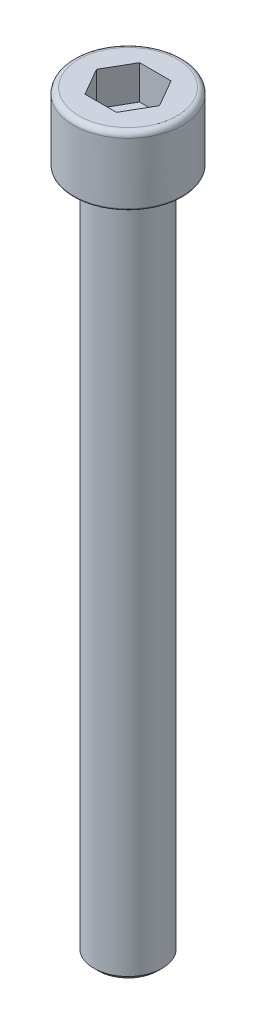
ISO-10303-21;
HEADER;
FILE_DESCRIPTION(('STEP AP214'),'2;1');
FILE_NAME('part.step','',(''),(''),'','','');
FILE_SCHEMA(('AUTOMOTIVE_DESIGN { 1 0 10303 214 1 1 1 1 }'));
ENDSEC;
DATA;
#1=APPLICATION_CONTEXT('core data for automotive mechanical design processes');
#2=APPLICATION_PROTOCOL_DEFINITION('international standard','automotive_design',2000,#1);
#3=PRODUCT_CONTEXT('',#1,'mechanical');
#4=PRODUCT('Part','Part','',(#3));
#5=PRODUCT_RELATED_PRODUCT_CATEGORY('part','',(#4));
#6=PRODUCT_DEFINITION_FORMATION('','',#4);
#7=PRODUCT_DEFINITION_CONTEXT('part definition',#1,'design');
#8=PRODUCT_DEFINITION('design','',#6,#7);
#9=PRODUCT_DEFINITION_SHAPE('','',#8);
#10=(LENGTH_UNIT() NAMED_UNIT(*) SI_UNIT(.MILLI.,.METRE.));
#11=(NAMED_UNIT(*) PLANE_ANGLE_UNIT() SI_UNIT($,.RADIAN.));
#12=(NAMED_UNIT(*) SI_UNIT($,.STERADIAN.) SOLID_ANGLE_UNIT());
#13=UNCERTAINTY_MEASURE_WITH_UNIT(LENGTH_MEASURE(1.E-05),#10,'distance_accuracy_value','');
#14=(GEOMETRIC_REPRESENTATION_CONTEXT(3) GLOBAL_UNCERTAINTY_ASSIGNED_CONTEXT((#13)) GLOBAL_UNIT_ASSIGNED_CONTEXT((#10,
#11,#12)) REPRESENTATION_CONTEXT('',''));
#15=CARTESIAN_POINT('',(0.,0.,0.));
#16=DIRECTION('',(0.,0.,1.));
#17=DIRECTION('',(1.,0.,0.));
#18=AXIS2_PLACEMENT_3D('',#15,#16,#17);
#19=CARTESIAN_POINT('',(0.,0.,0.));
#20=DIRECTION('',(0.,1.,0.));
#21=DIRECTION('',(0.,0.,1.));
#22=AXIS2_PLACEMENT_3D('',#19,#20,#21);
#23=PLANE('',#22);
#24=CARTESIAN_POINT('',(0.,0.,0.));
#25=DIRECTION('',(0.,1.,0.));
#26=DIRECTION('',(0.,0.,1.));
#27=AXIS2_PLACEMENT_3D('',#24,#25,#26);
#28=CIRCLE('',#27,7.2);
#29=CARTESIAN_POINT('',(0.,0.,7.2));
#30=VERTEX_POINT('',#29);
#31=EDGE_CURVE('E161',#30,#30,#28,.T.);
#32=ORIENTED_EDGE('',*,*,#31,.T.);
#33=EDGE_LOOP('',(#32));
#34=FACE_BOUND('',#33,.T.);
#35=DIRECTION('',(0.5,0.,-0.866025403784439));
#36=VECTOR('',#35,1.);
#37=CARTESIAN_POINT('',(2.3094010767585,0.,4.));
#38=LINE('',#37,#36);
#39=CARTESIAN_POINT('',(2.3094010767585,0.,4.));
#40=VERTEX_POINT('',#39);
#41=CARTESIAN_POINT('',(4.61880215351701,0.,0.));
#42=VERTEX_POINT('',#41);
#43=EDGE_CURVE('E66',#40,#42,#38,.T.);
#44=ORIENTED_EDGE('',*,*,#43,.F.);
#45=DIRECTION('',(1.,0.,0.));
#46=VECTOR('',#45,1.);
#47=CARTESIAN_POINT('',(-2.3094010767585,0.,4.));
#48=LINE('',#47,#46);
#49=CARTESIAN_POINT('',(-2.3094010767585,0.,4.));
#50=VERTEX_POINT('',#49);
#51=EDGE_CURVE('E149',#50,#40,#48,.T.);
#52=ORIENTED_EDGE('',*,*,#51,.F.);
#53=DIRECTION('',(0.5,0.,0.866025403784439));
#54=VECTOR('',#53,1.);
#55=CARTESIAN_POINT('',(-4.61880215351701,0.,0.));
#56=LINE('',#55,#54);
#57=CARTESIAN_POINT('',(-4.61880215351701,0.,0.));
#58=VERTEX_POINT('',#57);
#59=EDGE_CURVE('E147',#58,#50,#56,.T.);
#60=ORIENTED_EDGE('',*,*,#59,.F.);
#61=DIRECTION('',(-0.5,0.,0.866025403784439));
#62=VECTOR('',#61,1.);
#63=CARTESIAN_POINT('',(-2.3094010767585,0.,-4.));
#64=LINE('',#63,#62);
#65=CARTESIAN_POINT('',(-2.3094010767585,0.,-4.));
#66=VERTEX_POINT('',#65);
#67=EDGE_CURVE('E114',#66,#58,#64,.T.);
#68=ORIENTED_EDGE('',*,*,#67,.F.);
#69=DIRECTION('',(-1.,0.,0.));
#70=VECTOR('',#69,1.);
#71=CARTESIAN_POINT('',(2.3094010767585,0.,-4.));
#72=LINE('',#71,#70);
#73=CARTESIAN_POINT('',(2.3094010767585,0.,-4.));
#74=VERTEX_POINT('',#73);
#75=EDGE_CURVE('E143',#74,#66,#72,.T.);
#76=ORIENTED_EDGE('',*,*,#75,.F.);
#77=DIRECTION('',(-0.5,0.,-0.866025403784439));
#78=VECTOR('',#77,1.);
#79=CARTESIAN_POINT('',(4.61880215351701,0.,0.));
#80=LINE('',#79,#78);
#81=EDGE_CURVE('E140',#42,#74,#80,.T.);
#82=ORIENTED_EDGE('',*,*,#81,.F.);
#83=EDGE_LOOP('',(#44,#52,#60,#68,#76,#82));
#84=FACE_BOUND('',#83,.T.);
#85=ADVANCED_FACE('F51',(#34,#84),#23,.T.);
#86=CARTESIAN_POINT('',(0.,-115.,0.));
#87=DIRECTION('',(0.,-1.,0.));
#88=DIRECTION('',(0.,0.,-1.));
#89=AXIS2_PLACEMENT_3D('',#86,#87,#88);
#90=CYLINDRICAL_SURFACE('',#89,8.);
#91=CARTESIAN_POINT('',(0.,-9.75000000000001,0.));
#92=DIRECTION('',(0.,-1.,0.));
#93=DIRECTION('',(0.,0.,-1.));
#94=AXIS2_PLACEMENT_3D('',#91,#92,#93);
#95=CIRCLE('',#94,8.);
#96=CARTESIAN_POINT('',(0.,-9.75000000000001,-8.));
#97=VERTEX_POINT('',#96);
#98=EDGE_CURVE('E11',#97,#97,#95,.F.);
#99=ORIENTED_EDGE('',*,*,#98,.T.);
#100=EDGE_LOOP('',(#99));
#101=FACE_BOUND('',#100,.T.);
#102=CARTESIAN_POINT('',(0.,-0.799999999999995,0.));
#103=DIRECTION('',(0.,1.,0.));
#104=DIRECTION('',(0.,0.,1.));
#105=AXIS2_PLACEMENT_3D('',#102,#103,#104);
#106=CIRCLE('',#105,8.);
#107=CARTESIAN_POINT('',(0.,-0.799999999999995,8.));
#108=VERTEX_POINT('',#107);
#109=EDGE_CURVE('E153',#108,#108,#106,.F.);
#110=ORIENTED_EDGE('',*,*,#109,.T.);
#111=EDGE_LOOP('',(#110));
#112=FACE_BOUND('',#111,.T.);
#113=ADVANCED_FACE('F210',(#101,#112),#90,.T.);
#114=CARTESIAN_POINT('',(8.,-10.,0.));
#115=DIRECTION('',(0.,-1.,0.));
#116=DIRECTION('',(0.,0.,-1.));
#117=AXIS2_PLACEMENT_3D('',#114,#115,#116);
#118=PLANE('',#117);
#119=CARTESIAN_POINT('',(0.,-10.,0.));
#120=DIRECTION('',(0.,-1.,0.));
#121=DIRECTION('',(0.,0.,-1.));
#122=AXIS2_PLACEMENT_3D('',#119,#120,#121);
#123=CIRCLE('',#122,5.25000000000001);
#124=CARTESIAN_POINT('',(0.,-10.,-5.25000000000001));
#125=VERTEX_POINT('',#124);
#126=EDGE_CURVE('E59',#125,#125,#123,.F.);
#127=ORIENTED_EDGE('',*,*,#126,.T.);
#128=EDGE_LOOP('',(#127));
#129=FACE_BOUND('',#128,.T.);
#130=CARTESIAN_POINT('',(0.,-10.,0.));
#131=DIRECTION('',(0.,-1.,0.));
#132=DIRECTION('',(0.,0.,-1.));
#133=AXIS2_PLACEMENT_3D('',#130,#131,#132);
#134=CIRCLE('',#133,7.75);
#135=CARTESIAN_POINT('',(0.,-10.,-7.75));
#136=VERTEX_POINT('',#135);
#137=EDGE_CURVE('E173',#136,#136,#134,.T.);
#138=ORIENTED_EDGE('',*,*,#137,.T.);
#139=EDGE_LOOP('',(#138));
#140=FACE_BOUND('',#139,.T.);
#141=ADVANCED_FACE('F178',(#129,#140),#118,.T.);
#142=CARTESIAN_POINT('',(0.,-115.,0.));
#143=DIRECTION('',(0.,-1.,0.));
#144=DIRECTION('',(0.,0.,-1.));
#145=AXIS2_PLACEMENT_3D('',#142,#143,#144);
#146=CYLINDRICAL_SURFACE('',#145,5.00000000000001);
#147=CARTESIAN_POINT('',(0.,-10.25,0.));
#148=DIRECTION('',(0.,-1.,0.));
#149=DIRECTION('',(0.,0.,-1.));
#150=AXIS2_PLACEMENT_3D('',#147,#148,#149);
#151=CIRCLE('',#150,5.00000000000001);
#152=CARTESIAN_POINT('',(0.,-10.25,-5.00000000000001));
#153=VERTEX_POINT('',#152);
#154=EDGE_CURVE('E170',#153,#153,#151,.T.);
#155=ORIENTED_EDGE('',*,*,#154,.T.);
#156=EDGE_LOOP('',(#155));
#157=FACE_BOUND('',#156,.T.);
#158=CARTESIAN_POINT('',(0.,-109.375,0.));
#159=DIRECTION('',(0.,-1.,0.));
#160=DIRECTION('',(0.,0.,-1.));
#161=AXIS2_PLACEMENT_3D('',#158,#159,#160);
#162=CIRCLE('',#161,5.00000000000001);
#163=CARTESIAN_POINT('',(0.,-109.375,-5.00000000000001));
#164=VERTEX_POINT('',#163);
#165=EDGE_CURVE('E167',#164,#164,#162,.F.);
#166=ORIENTED_EDGE('',*,*,#165,.T.);
#167=EDGE_LOOP('',(#166));
#168=FACE_BOUND('',#167,.T.);
#169=ADVANCED_FACE('F187',(#157,#168),#146,.T.);
#170=CARTESIAN_POINT('',(5.00000000000001,-110.,0.));
#171=DIRECTION('',(0.,-1.,0.));
#172=DIRECTION('',(0.,0.,-1.));
#173=AXIS2_PLACEMENT_3D('',#170,#171,#172);
#174=PLANE('',#173);
#175=CARTESIAN_POINT('',(0.,-110.,0.));
#176=DIRECTION('',(0.,-1.,0.));
#177=DIRECTION('',(0.,0.,-1.));
#178=AXIS2_PLACEMENT_3D('',#175,#176,#177);
#179=CIRCLE('',#178,4.375);
#180=CARTESIAN_POINT('',(0.,-110.,-4.375));
#181=VERTEX_POINT('',#180);
#182=EDGE_CURVE('E164',#181,#181,#179,.T.);
#183=ORIENTED_EDGE('',*,*,#182,.T.);
#184=EDGE_LOOP('',(#183));
#185=FACE_BOUND('',#184,.T.);
#186=ADVANCED_FACE('F190',(#185),#174,.T.);
#187=CARTESIAN_POINT('',(2.3094010767585,-5.,4.));
#188=DIRECTION('',(0.866025403784439,0.,0.5));
#189=DIRECTION('',(0.5,0.,-0.866025403784439));
#190=AXIS2_PLACEMENT_3D('',#187,#188,#189);
#191=PLANE('',#190);
#192=ORIENTED_EDGE('',*,*,#43,.T.);
#193=DIRECTION('',(0.,1.,0.));
#194=VECTOR('',#193,1.);
#195=CARTESIAN_POINT('',(4.61880215351701,-5.,0.));
#196=LINE('',#195,#194);
#197=CARTESIAN_POINT('',(4.61880215351701,-5.,0.));
#198=VERTEX_POINT('',#197);
#199=EDGE_CURVE('E96',#198,#42,#196,.T.);
#200=ORIENTED_EDGE('',*,*,#199,.F.);
#201=DIRECTION('',(0.5,0.,-0.866025403784439));
#202=VECTOR('',#201,1.);
#203=CARTESIAN_POINT('',(2.3094010767585,-5.,4.));
#204=LINE('',#203,#202);
#205=CARTESIAN_POINT('',(2.3094010767585,-5.,4.));
#206=VERTEX_POINT('',#205);
#207=EDGE_CURVE('E151',#206,#198,#204,.T.);
#208=ORIENTED_EDGE('',*,*,#207,.F.);
#209=DIRECTION('',(0.,1.,0.));
#210=VECTOR('',#209,1.);
#211=CARTESIAN_POINT('',(2.3094010767585,-5.,4.));
#212=LINE('',#211,#210);
#213=EDGE_CURVE('E74',#206,#40,#212,.T.);
#214=ORIENTED_EDGE('',*,*,#213,.T.);
#215=EDGE_LOOP('',(#192,#200,#208,#214));
#216=FACE_BOUND('',#215,.T.);
#217=ADVANCED_FACE('F201',(#216),#191,.F.);
#218=CARTESIAN_POINT('',(-2.3094010767585,-5.,4.));
#219=DIRECTION('',(0.,0.,1.));
#220=DIRECTION('',(1.,0.,0.));
#221=AXIS2_PLACEMENT_3D('',#218,#219,#220);
#222=PLANE('',#221);
#223=ORIENTED_EDGE('',*,*,#51,.T.);
#224=ORIENTED_EDGE('',*,*,#213,.F.);
#225=DIRECTION('',(1.,0.,0.));
#226=VECTOR('',#225,1.);
#227=CARTESIAN_POINT('',(-2.3094010767585,-5.,4.));
#228=LINE('',#227,#226);
#229=CARTESIAN_POINT('',(-2.3094010767585,-5.,4.));
#230=VERTEX_POINT('',#229);
#231=EDGE_CURVE('E126',#230,#206,#228,.T.);
#232=ORIENTED_EDGE('',*,*,#231,.F.);
#233=DIRECTION('',(0.,1.,0.));
#234=VECTOR('',#233,1.);
#235=CARTESIAN_POINT('',(-2.3094010767585,-5.,4.));
#236=LINE('',#235,#234);
#237=EDGE_CURVE('E118',#230,#50,#236,.T.);
#238=ORIENTED_EDGE('',*,*,#237,.T.);
#239=EDGE_LOOP('',(#223,#224,#232,#238));
#240=FACE_BOUND('',#239,.T.);
#241=ADVANCED_FACE('F207',(#240),#222,.F.);
#242=CARTESIAN_POINT('',(-4.61880215351701,-5.,0.));
#243=DIRECTION('',(-0.866025403784438,0.,0.5));
#244=DIRECTION('',(0.5,0.,0.866025403784439));
#245=AXIS2_PLACEMENT_3D('',#242,#243,#244);
#246=PLANE('',#245);
#247=ORIENTED_EDGE('',*,*,#59,.T.);
#248=ORIENTED_EDGE('',*,*,#237,.F.);
#249=DIRECTION('',(0.5,0.,0.866025403784439));
#250=VECTOR('',#249,1.);
#251=CARTESIAN_POINT('',(-4.61880215351701,-5.,0.));
#252=LINE('',#251,#250);
#253=CARTESIAN_POINT('',(-4.61880215351701,-5.,0.));
#254=VERTEX_POINT('',#253);
#255=EDGE_CURVE('E122',#254,#230,#252,.T.);
#256=ORIENTED_EDGE('',*,*,#255,.F.);
#257=DIRECTION('',(0.,1.,0.));
#258=VECTOR('',#257,1.);
#259=CARTESIAN_POINT('',(-4.61880215351701,-5.,0.));
#260=LINE('',#259,#258);
#261=EDGE_CURVE('E107',#254,#58,#260,.T.);
#262=ORIENTED_EDGE('',*,*,#261,.T.);
#263=EDGE_LOOP('',(#247,#248,#256,#262));
#264=FACE_BOUND('',#263,.T.);
#265=ADVANCED_FACE('F123',(#264),#246,.F.);
#266=CARTESIAN_POINT('',(-2.3094010767585,-5.,-4.));
#267=DIRECTION('',(-0.866025403784439,0.,-0.5));
#268=DIRECTION('',(-0.5,0.,0.866025403784439));
#269=AXIS2_PLACEMENT_3D('',#266,#267,#268);
#270=PLANE('',#269);
#271=ORIENTED_EDGE('',*,*,#67,.T.);
#272=ORIENTED_EDGE('',*,*,#261,.F.);
#273=DIRECTION('',(-0.5,0.,0.866025403784439));
#274=VECTOR('',#273,1.);
#275=CARTESIAN_POINT('',(-2.3094010767585,-5.,-4.));
#276=LINE('',#275,#274);
#277=CARTESIAN_POINT('',(-2.3094010767585,-5.,-4.));
#278=VERTEX_POINT('',#277);
#279=EDGE_CURVE('E111',#278,#254,#276,.T.);
#280=ORIENTED_EDGE('',*,*,#279,.F.);
#281=DIRECTION('',(0.,1.,0.));
#282=VECTOR('',#281,1.);
#283=CARTESIAN_POINT('',(-2.3094010767585,-5.,-4.));
#284=LINE('',#283,#282);
#285=EDGE_CURVE('E119',#278,#66,#284,.T.);
#286=ORIENTED_EDGE('',*,*,#285,.T.);
#287=EDGE_LOOP('',(#271,#272,#280,#286));
#288=FACE_BOUND('',#287,.T.);
#289=ADVANCED_FACE('F109',(#288),#270,.F.);
#290=CARTESIAN_POINT('',(2.3094010767585,-5.,-4.));
#291=DIRECTION('',(0.,0.,-1.));
#292=DIRECTION('',(-1.,0.,0.));
#293=AXIS2_PLACEMENT_3D('',#290,#291,#292);
#294=PLANE('',#293);
#295=ORIENTED_EDGE('',*,*,#75,.T.);
#296=ORIENTED_EDGE('',*,*,#285,.F.);
#297=DIRECTION('',(-1.,0.,0.));
#298=VECTOR('',#297,1.);
#299=CARTESIAN_POINT('',(2.3094010767585,-5.,-4.));
#300=LINE('',#299,#298);
#301=CARTESIAN_POINT('',(2.3094010767585,-5.,-4.));
#302=VERTEX_POINT('',#301);
#303=EDGE_CURVE('E132',#302,#278,#300,.T.);
#304=ORIENTED_EDGE('',*,*,#303,.F.);
#305=DIRECTION('',(0.,1.,0.));
#306=VECTOR('',#305,1.);
#307=CARTESIAN_POINT('',(2.3094010767585,-5.,-4.));
#308=LINE('',#307,#306);
#309=EDGE_CURVE('E156',#302,#74,#308,.T.);
#310=ORIENTED_EDGE('',*,*,#309,.T.);
#311=EDGE_LOOP('',(#295,#296,#304,#310));
#312=FACE_BOUND('',#311,.T.);
#313=ADVANCED_FACE('F238',(#312),#294,.F.);
#314=CARTESIAN_POINT('',(4.61880215351701,-5.,0.));
#315=DIRECTION('',(0.866025403784439,0.,-0.5));
#316=DIRECTION('',(-0.5,0.,-0.866025403784439));
#317=AXIS2_PLACEMENT_3D('',#314,#315,#316);
#318=PLANE('',#317);
#319=ORIENTED_EDGE('',*,*,#81,.T.);
#320=ORIENTED_EDGE('',*,*,#309,.F.);
#321=DIRECTION('',(-0.5,0.,-0.866025403784439));
#322=VECTOR('',#321,1.);
#323=CARTESIAN_POINT('',(4.61880215351701,-5.,0.));
#324=LINE('',#323,#322);
#325=EDGE_CURVE('E134',#198,#302,#324,.T.);
#326=ORIENTED_EDGE('',*,*,#325,.F.);
#327=ORIENTED_EDGE('',*,*,#199,.T.);
#328=EDGE_LOOP('',(#319,#320,#326,#327));
#329=FACE_BOUND('',#328,.T.);
#330=ADVANCED_FACE('F229',(#329),#318,.F.);
#331=CARTESIAN_POINT('',(0.,-5.,0.));
#332=DIRECTION('',(0.,1.,0.));
#333=DIRECTION('',(0.,0.,1.));
#334=AXIS2_PLACEMENT_3D('',#331,#332,#333);
#335=PLANE('',#334);
#336=ORIENTED_EDGE('',*,*,#207,.T.);
#337=ORIENTED_EDGE('',*,*,#325,.T.);
#338=ORIENTED_EDGE('',*,*,#303,.T.);
#339=ORIENTED_EDGE('',*,*,#279,.T.);
#340=ORIENTED_EDGE('',*,*,#255,.T.);
#341=ORIENTED_EDGE('',*,*,#231,.T.);
#342=EDGE_LOOP('',(#336,#337,#338,#339,#340,#341));
#343=FACE_BOUND('',#342,.T.);
#344=ADVANCED_FACE('F129',(#343),#335,.T.);
#345=CARTESIAN_POINT('',(0.,-0.799999999999995,0.));
#346=DIRECTION('',(0.,1.,0.));
#347=DIRECTION('',(0.,0.,1.));
#348=AXIS2_PLACEMENT_3D('',#345,#346,#347);
#349=TOROIDAL_SURFACE('',#348,7.2,0.8);
#350=ORIENTED_EDGE('',*,*,#31,.F.);
#351=EDGE_LOOP('',(#350));
#352=FACE_BOUND('',#351,.T.);
#353=ORIENTED_EDGE('',*,*,#109,.F.);
#354=EDGE_LOOP('',(#353));
#355=FACE_BOUND('',#354,.T.);
#356=ADVANCED_FACE('F196',(#352,#355),#349,.T.);
#357=CARTESIAN_POINT('',(0.,-110.,0.));
#358=DIRECTION('',(0.,1.,0.));
#359=DIRECTION('',(0.,0.,1.));
#360=AXIS2_PLACEMENT_3D('',#357,#358,#359);
#361=CONICAL_SURFACE('',#360,4.375,0.78539816339745);
#362=ORIENTED_EDGE('',*,*,#165,.F.);
#363=EDGE_LOOP('',(#362));
#364=FACE_BOUND('',#363,.T.);
#365=ORIENTED_EDGE('',*,*,#182,.F.);
#366=EDGE_LOOP('',(#365));
#367=FACE_BOUND('',#366,.T.);
#368=ADVANCED_FACE('F184',(#364,#367),#361,.T.);
#369=CARTESIAN_POINT('',(0.,-10.25,0.));
#370=DIRECTION('',(0.,-1.,0.));
#371=DIRECTION('',(0.,0.,-1.));
#372=AXIS2_PLACEMENT_3D('',#369,#370,#371);
#373=TOROIDAL_SURFACE('',#372,5.25000000000001,0.25);
#374=ORIENTED_EDGE('',*,*,#126,.F.);
#375=EDGE_LOOP('',(#374));
#376=FACE_BOUND('',#375,.T.);
#377=ORIENTED_EDGE('',*,*,#154,.F.);
#378=EDGE_LOOP('',(#377));
#379=FACE_BOUND('',#378,.T.);
#380=ADVANCED_FACE('F181',(#376,#379),#373,.F.);
#381=CARTESIAN_POINT('',(0.,-9.75000000000001,0.));
#382=DIRECTION('',(0.,-1.,0.));
#383=DIRECTION('',(0.,0.,-1.));
#384=AXIS2_PLACEMENT_3D('',#381,#382,#383);
#385=TOROIDAL_SURFACE('',#384,7.75,0.25);
#386=ORIENTED_EDGE('',*,*,#98,.F.);
#387=EDGE_LOOP('',(#386));
#388=FACE_BOUND('',#387,.T.);
#389=ORIENTED_EDGE('',*,*,#137,.F.);
#390=EDGE_LOOP('',(#389));
#391=FACE_BOUND('',#390,.T.);
#392=ADVANCED_FACE('F53',(#388,#391),#385,.T.);
#393=CLOSED_SHELL('',(#85,#113,#141,#169,#186,#217,#241,#265,#289,#313,#330,#344,#356,#368,#380,#392));
#394=MANIFOLD_SOLID_BREP('B2',#393);
#395=ADVANCED_BREP_SHAPE_REPRESENTATION('',(#18,#394),#14);
#396=SHAPE_DEFINITION_REPRESENTATION(#9,#395);
ENDSEC;
END-ISO-10303-21;
